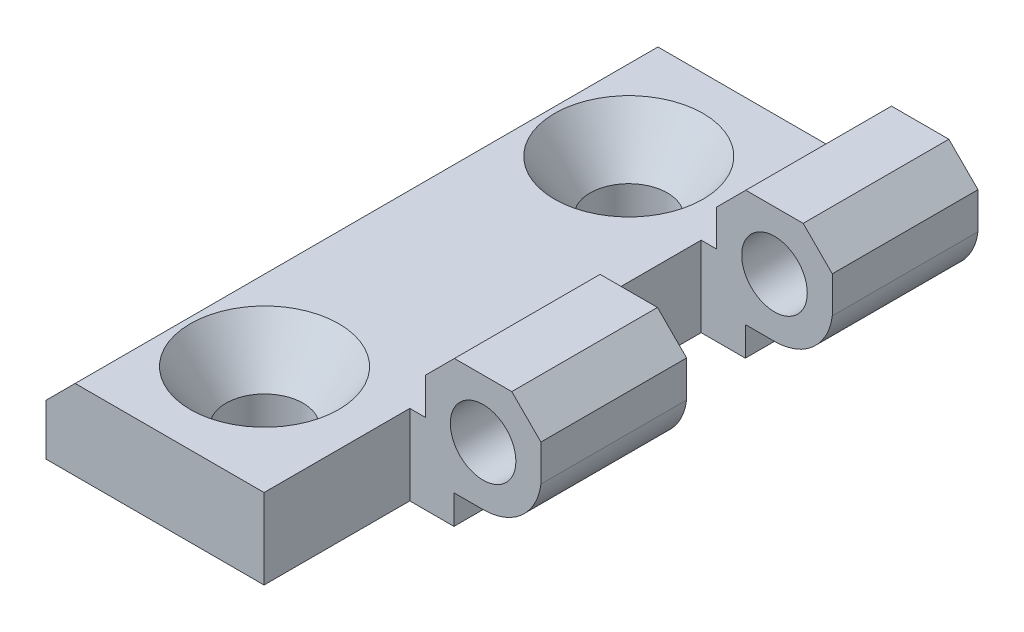
ISO-10303-21;
HEADER;
FILE_DESCRIPTION(('STEP AP214'),'2;1');
FILE_NAME('part.step','',(''),(''),'','','');
FILE_SCHEMA(('AUTOMOTIVE_DESIGN { 1 0 10303 214 1 1 1 1 }'));
ENDSEC;
DATA;
#1=APPLICATION_CONTEXT('core data for automotive mechanical design processes');
#2=APPLICATION_PROTOCOL_DEFINITION('international standard','automotive_design',2000,#1);
#3=PRODUCT_CONTEXT('',#1,'mechanical');
#4=PRODUCT('Part','Part','',(#3));
#5=PRODUCT_RELATED_PRODUCT_CATEGORY('part','',(#4));
#6=PRODUCT_DEFINITION_FORMATION('','',#4);
#7=PRODUCT_DEFINITION_CONTEXT('part definition',#1,'design');
#8=PRODUCT_DEFINITION('design','',#6,#7);
#9=PRODUCT_DEFINITION_SHAPE('','',#8);
#10=(LENGTH_UNIT() NAMED_UNIT(*) SI_UNIT(.MILLI.,.METRE.));
#11=(NAMED_UNIT(*) PLANE_ANGLE_UNIT() SI_UNIT($,.RADIAN.));
#12=(NAMED_UNIT(*) SI_UNIT($,.STERADIAN.) SOLID_ANGLE_UNIT());
#13=UNCERTAINTY_MEASURE_WITH_UNIT(LENGTH_MEASURE(1.E-05),#10,'distance_accuracy_value','');
#14=(GEOMETRIC_REPRESENTATION_CONTEXT(3) GLOBAL_UNCERTAINTY_ASSIGNED_CONTEXT((#13)) GLOBAL_UNIT_ASSIGNED_CONTEXT((#10,
#11,#12)) REPRESENTATION_CONTEXT('',''));
#15=CARTESIAN_POINT('',(0.,0.,0.));
#16=DIRECTION('',(0.,0.,1.));
#17=DIRECTION('',(1.,0.,0.));
#18=AXIS2_PLACEMENT_3D('',#15,#16,#17);
#19=CARTESIAN_POINT('',(0.,5.5,0.));
#20=DIRECTION('',(0.,1.,0.));
#21=DIRECTION('',(0.,0.,1.));
#22=AXIS2_PLACEMENT_3D('',#19,#20,#21);
#23=PLANE('',#22);
#24=CARTESIAN_POINT('',(-12.5,5.5,-12.5));
#25=DIRECTION('',(0.,1.,0.));
#26=DIRECTION('',(0.,0.,1.));
#27=AXIS2_PLACEMENT_3D('',#24,#25,#26);
#28=CIRCLE('',#27,5.1);
#29=CARTESIAN_POINT('',(-12.5,5.5,-7.4));
#30=VERTEX_POINT('',#29);
#31=EDGE_CURVE('E813',#30,#30,#28,.T.);
#32=ORIENTED_EDGE('',*,*,#31,.F.);
#33=EDGE_LOOP('',(#32));
#34=FACE_BOUND('',#33,.T.);
#35=CARTESIAN_POINT('',(-12.5,5.5,12.5));
#36=DIRECTION('',(0.,1.,0.));
#37=DIRECTION('',(0.,0.,1.));
#38=AXIS2_PLACEMENT_3D('',#35,#36,#37);
#39=CIRCLE('',#38,5.1);
#40=CARTESIAN_POINT('',(-12.5,5.5,17.6));
#41=VERTEX_POINT('',#40);
#42=EDGE_CURVE('E260',#41,#41,#39,.T.);
#43=ORIENTED_EDGE('',*,*,#42,.F.);
#44=EDGE_LOOP('',(#43));
#45=FACE_BOUND('',#44,.T.);
#46=DIRECTION('',(1.,0.,0.));
#47=VECTOR('',#46,1.);
#48=CARTESIAN_POINT('',(-20.,5.5,20.));
#49=LINE('',#48,#47);
#50=CARTESIAN_POINT('',(-18.,5.5,20.));
#51=VERTEX_POINT('',#50);
#52=CARTESIAN_POINT('',(-5.03137303340311,5.5,20.));
#53=VERTEX_POINT('',#52);
#54=EDGE_CURVE('E232',#51,#53,#49,.T.);
#55=ORIENTED_EDGE('',*,*,#54,.T.);
#56=DIRECTION('',(0.,0.,-1.));
#57=VECTOR('',#56,1.);
#58=CARTESIAN_POINT('',(-5.03137303340312,5.5,0.));
#59=LINE('',#58,#57);
#60=CARTESIAN_POINT('',(-5.03137303340312,5.5,10.));
#61=VERTEX_POINT('',#60);
#62=EDGE_CURVE('E53',#53,#61,#59,.T.);
#63=ORIENTED_EDGE('',*,*,#62,.T.);
#64=DIRECTION('',(1.,0.,0.));
#65=VECTOR('',#64,1.);
#66=CARTESIAN_POINT('',(0.,5.5,10.));
#67=LINE('',#66,#65);
#68=CARTESIAN_POINT('',(-3.96862696659689,5.5,10.));
#69=VERTEX_POINT('',#68);
#70=EDGE_CURVE('E281',#61,#69,#67,.T.);
#71=ORIENTED_EDGE('',*,*,#70,.T.);
#72=DIRECTION('',(0.,0.,1.));
#73=VECTOR('',#72,1.);
#74=CARTESIAN_POINT('',(-3.96862696659689,5.5,-31.2694276695847));
#75=LINE('',#74,#73);
#76=CARTESIAN_POINT('',(-3.96862696659689,5.5,0.));
#77=VERTEX_POINT('',#76);
#78=EDGE_CURVE('E379',#77,#69,#75,.T.);
#79=ORIENTED_EDGE('',*,*,#78,.F.);
#80=DIRECTION('',(-1.,0.,0.));
#81=VECTOR('',#80,1.);
#82=CARTESIAN_POINT('',(0.,5.5,0.));
#83=LINE('',#82,#81);
#84=CARTESIAN_POINT('',(-5.03137303340312,5.5,0.));
#85=VERTEX_POINT('',#84);
#86=EDGE_CURVE('E340',#77,#85,#83,.T.);
#87=ORIENTED_EDGE('',*,*,#86,.T.);
#88=DIRECTION('',(0.,0.,-1.));
#89=VECTOR('',#88,1.);
#90=CARTESIAN_POINT('',(-5.03137303340312,5.5,0.));
#91=LINE('',#90,#89);
#92=CARTESIAN_POINT('',(-5.03137303340312,5.5,-10.));
#93=VERTEX_POINT('',#92);
#94=EDGE_CURVE('E358',#85,#93,#91,.T.);
#95=ORIENTED_EDGE('',*,*,#94,.T.);
#96=DIRECTION('',(1.,0.,0.));
#97=VECTOR('',#96,1.);
#98=CARTESIAN_POINT('',(0.,5.5,-10.));
#99=LINE('',#98,#97);
#100=CARTESIAN_POINT('',(-3.96862696659689,5.5,-10.));
#101=VERTEX_POINT('',#100);
#102=EDGE_CURVE('E321',#93,#101,#99,.T.);
#103=ORIENTED_EDGE('',*,*,#102,.T.);
#104=CARTESIAN_POINT('',(-3.96862696659689,5.5,-20.));
#105=VERTEX_POINT('',#104);
#106=EDGE_CURVE('E369',#105,#101,#75,.T.);
#107=ORIENTED_EDGE('',*,*,#106,.F.);
#108=DIRECTION('',(-1.,0.,0.));
#109=VECTOR('',#108,1.);
#110=CARTESIAN_POINT('',(-20.,5.5,-20.));
#111=LINE('',#110,#109);
#112=CARTESIAN_POINT('',(-18.,5.5,-20.));
#113=VERTEX_POINT('',#112);
#114=EDGE_CURVE('E241',#105,#113,#111,.T.);
#115=ORIENTED_EDGE('',*,*,#114,.T.);
#116=DIRECTION('',(0.,0.,1.));
#117=VECTOR('',#116,1.);
#118=CARTESIAN_POINT('',(-18.,5.5,20.));
#119=LINE('',#118,#117);
#120=EDGE_CURVE('E243',#113,#51,#119,.T.);
#121=ORIENTED_EDGE('',*,*,#120,.T.);
#122=EDGE_LOOP('',(#55,#63,#71,#79,#87,#95,#103,#107,#115,#121));
#123=FACE_BOUND('',#122,.T.);
#124=ADVANCED_FACE('F36',(#34,#45,#123),#23,.T.);
#125=CARTESIAN_POINT('',(0.,0.,0.));
#126=DIRECTION('',(0.,1.,0.));
#127=DIRECTION('',(0.,0.,1.));
#128=AXIS2_PLACEMENT_3D('',#125,#126,#127);
#129=PLANE('',#128);
#130=CARTESIAN_POINT('',(-12.5,0.,-12.5));
#131=DIRECTION('',(0.,1.,0.));
#132=DIRECTION('',(0.,0.,1.));
#133=AXIS2_PLACEMENT_3D('',#130,#131,#132);
#134=CIRCLE('',#133,2.65);
#135=CARTESIAN_POINT('',(-12.5,0.,-9.85));
#136=VERTEX_POINT('',#135);
#137=EDGE_CURVE('E40',#136,#136,#134,.T.);
#138=ORIENTED_EDGE('',*,*,#137,.T.);
#139=EDGE_LOOP('',(#138));
#140=FACE_BOUND('',#139,.T.);
#141=CARTESIAN_POINT('',(-12.5,0.,12.5));
#142=DIRECTION('',(0.,1.,0.));
#143=DIRECTION('',(0.,0.,1.));
#144=AXIS2_PLACEMENT_3D('',#141,#142,#143);
#145=CIRCLE('',#144,2.65);
#146=CARTESIAN_POINT('',(-12.5,0.,15.15));
#147=VERTEX_POINT('',#146);
#148=EDGE_CURVE('E222',#147,#147,#145,.T.);
#149=ORIENTED_EDGE('',*,*,#148,.T.);
#150=EDGE_LOOP('',(#149));
#151=FACE_BOUND('',#150,.T.);
#152=DIRECTION('',(0.,0.,1.));
#153=VECTOR('',#152,1.);
#154=CARTESIAN_POINT('',(-5.03137303340312,0.,10.));
#155=LINE('',#154,#153);
#156=CARTESIAN_POINT('',(-5.03137303340312,0.,10.));
#157=VERTEX_POINT('',#156);
#158=CARTESIAN_POINT('',(-5.03137303340311,0.,20.));
#159=VERTEX_POINT('',#158);
#160=EDGE_CURVE('E206',#157,#159,#155,.T.);
#161=ORIENTED_EDGE('',*,*,#160,.T.);
#162=DIRECTION('',(1.,0.,0.));
#163=VECTOR('',#162,1.);
#164=CARTESIAN_POINT('',(-20.,0.,20.));
#165=LINE('',#164,#163);
#166=CARTESIAN_POINT('',(-20.,0.,20.));
#167=VERTEX_POINT('',#166);
#168=EDGE_CURVE('E218',#167,#159,#165,.T.);
#169=ORIENTED_EDGE('',*,*,#168,.F.);
#170=DIRECTION('',(0.,0.,1.));
#171=VECTOR('',#170,1.);
#172=CARTESIAN_POINT('',(-20.,0.,-20.));
#173=LINE('',#172,#171);
#174=CARTESIAN_POINT('',(-20.,0.,-20.));
#175=VERTEX_POINT('',#174);
#176=EDGE_CURVE('E228',#175,#167,#173,.T.);
#177=ORIENTED_EDGE('',*,*,#176,.F.);
#178=DIRECTION('',(-1.,0.,0.));
#179=VECTOR('',#178,1.);
#180=CARTESIAN_POINT('',(-20.,0.,-20.));
#181=LINE('',#180,#179);
#182=CARTESIAN_POINT('',(-2.,0.,-20.));
#183=VERTEX_POINT('',#182);
#184=EDGE_CURVE('E227',#183,#175,#181,.T.);
#185=ORIENTED_EDGE('',*,*,#184,.F.);
#186=DIRECTION('',(0.,0.,1.));
#187=VECTOR('',#186,1.);
#188=CARTESIAN_POINT('',(-2.,0.,-20.));
#189=LINE('',#188,#187);
#190=CARTESIAN_POINT('',(-2.,0.,-10.));
#191=VERTEX_POINT('',#190);
#192=EDGE_CURVE('E235',#183,#191,#189,.T.);
#193=ORIENTED_EDGE('',*,*,#192,.T.);
#194=DIRECTION('',(-1.,0.,0.));
#195=VECTOR('',#194,1.);
#196=CARTESIAN_POINT('',(-5.03137303340312,0.,-10.));
#197=LINE('',#196,#195);
#198=CARTESIAN_POINT('',(-5.03137303340312,0.,-10.));
#199=VERTEX_POINT('',#198);
#200=EDGE_CURVE('E301',#191,#199,#197,.T.);
#201=ORIENTED_EDGE('',*,*,#200,.T.);
#202=DIRECTION('',(0.,0.,1.));
#203=VECTOR('',#202,1.);
#204=CARTESIAN_POINT('',(-5.03137303340312,0.,-10.));
#205=LINE('',#204,#203);
#206=CARTESIAN_POINT('',(-5.03137303340312,0.,0.));
#207=VERTEX_POINT('',#206);
#208=EDGE_CURVE('E297',#199,#207,#205,.T.);
#209=ORIENTED_EDGE('',*,*,#208,.T.);
#210=DIRECTION('',(1.,0.,0.));
#211=VECTOR('',#210,1.);
#212=CARTESIAN_POINT('',(-5.03137303340312,0.,0.));
#213=LINE('',#212,#211);
#214=CARTESIAN_POINT('',(-2.,0.,0.));
#215=VERTEX_POINT('',#214);
#216=EDGE_CURVE('E306',#207,#215,#213,.T.);
#217=ORIENTED_EDGE('',*,*,#216,.T.);
#218=CARTESIAN_POINT('',(-2.,0.,10.));
#219=VERTEX_POINT('',#218);
#220=EDGE_CURVE('E410',#215,#219,#189,.T.);
#221=ORIENTED_EDGE('',*,*,#220,.T.);
#222=DIRECTION('',(-1.,0.,0.));
#223=VECTOR('',#222,1.);
#224=CARTESIAN_POINT('',(-5.03137303340312,0.,10.));
#225=LINE('',#224,#223);
#226=EDGE_CURVE('E221',#219,#157,#225,.T.);
#227=ORIENTED_EDGE('',*,*,#226,.T.);
#228=EDGE_LOOP('',(#161,#169,#177,#185,#193,#201,#209,#217,#221,#227));
#229=FACE_BOUND('',#228,.T.);
#230=ADVANCED_FACE('F216',(#140,#151,#229),#129,.F.);
#231=CARTESIAN_POINT('',(-2.,0.,-20.));
#232=DIRECTION('',(-1.,0.,0.));
#233=DIRECTION('',(0.,0.,1.));
#234=AXIS2_PLACEMENT_3D('',#231,#232,#233);
#235=PLANE('',#234);
#236=DIRECTION('',(0.,1.,0.));
#237=VECTOR('',#236,1.);
#238=CARTESIAN_POINT('',(-2.,0.,10.));
#239=LINE('',#238,#237);
#240=CARTESIAN_POINT('',(-2.,2.,10.));
#241=VERTEX_POINT('',#240);
#242=EDGE_CURVE('E292',#219,#241,#239,.T.);
#243=ORIENTED_EDGE('',*,*,#242,.F.);
#244=ORIENTED_EDGE('',*,*,#220,.F.);
#245=DIRECTION('',(0.,-1.,0.));
#246=VECTOR('',#245,1.);
#247=CARTESIAN_POINT('',(-2.,0.,0.));
#248=LINE('',#247,#246);
#249=CARTESIAN_POINT('',(-2.,2.,0.));
#250=VERTEX_POINT('',#249);
#251=EDGE_CURVE('E352',#250,#215,#248,.T.);
#252=ORIENTED_EDGE('',*,*,#251,.F.);
#253=DIRECTION('',(0.,0.,1.));
#254=VECTOR('',#253,1.);
#255=CARTESIAN_POINT('',(-2.,2.,-20.));
#256=LINE('',#255,#254);
#257=EDGE_CURVE('E414',#250,#241,#256,.T.);
#258=ORIENTED_EDGE('',*,*,#257,.T.);
#259=EDGE_LOOP('',(#243,#244,#252,#258));
#260=FACE_BOUND('',#259,.T.);
#261=ADVANCED_FACE('F483',(#260),#235,.F.);
#262=CARTESIAN_POINT('',(0.,2.,-20.));
#263=DIRECTION('',(0.,1.,0.));
#264=DIRECTION('',(-1.,0.,0.));
#265=AXIS2_PLACEMENT_3D('',#262,#263,#264);
#266=PLANE('',#265);
#267=DIRECTION('',(1.,0.,0.));
#268=VECTOR('',#267,1.);
#269=CARTESIAN_POINT('',(0.,2.,10.));
#270=LINE('',#269,#268);
#271=CARTESIAN_POINT('',(0.,2.,10.));
#272=VERTEX_POINT('',#271);
#273=EDGE_CURVE('E290',#241,#272,#270,.T.);
#274=ORIENTED_EDGE('',*,*,#273,.F.);
#275=ORIENTED_EDGE('',*,*,#257,.F.);
#276=DIRECTION('',(-1.,0.,0.));
#277=VECTOR('',#276,1.);
#278=CARTESIAN_POINT('',(0.,2.,0.));
#279=LINE('',#278,#277);
#280=CARTESIAN_POINT('',(0.,2.,0.));
#281=VERTEX_POINT('',#280);
#282=EDGE_CURVE('E350',#281,#250,#279,.T.);
#283=ORIENTED_EDGE('',*,*,#282,.F.);
#284=DIRECTION('',(0.,0.,1.));
#285=VECTOR('',#284,1.);
#286=CARTESIAN_POINT('',(0.,2.,-20.));
#287=LINE('',#286,#285);
#288=EDGE_CURVE('E407',#281,#272,#287,.T.);
#289=ORIENTED_EDGE('',*,*,#288,.T.);
#290=EDGE_LOOP('',(#274,#275,#283,#289));
#291=FACE_BOUND('',#290,.T.);
#292=ADVANCED_FACE('F492',(#291),#266,.F.);
#293=CARTESIAN_POINT('',(0.,6.,-31.2694276695847));
#294=DIRECTION('',(0.,0.,1.));
#295=DIRECTION('',(1.,0.,0.));
#296=AXIS2_PLACEMENT_3D('',#293,#294,#295);
#297=CYLINDRICAL_SURFACE('',#296,2.25);
#298=CARTESIAN_POINT('',(0.,6.,0.));
#299=DIRECTION('',(0.,0.,-1.));
#300=DIRECTION('',(-1.,0.,0.));
#301=AXIS2_PLACEMENT_3D('',#298,#299,#300);
#302=CIRCLE('',#301,2.25);
#303=CARTESIAN_POINT('',(-2.25,6.,0.));
#304=VERTEX_POINT('',#303);
#305=EDGE_CURVE('E354',#304,#304,#302,.F.);
#306=ORIENTED_EDGE('',*,*,#305,.F.);
#307=EDGE_LOOP('',(#306));
#308=FACE_BOUND('',#307,.T.);
#309=CARTESIAN_POINT('',(0.,6.,10.));
#310=DIRECTION('',(0.,0.,1.));
#311=DIRECTION('',(1.,0.,0.));
#312=AXIS2_PLACEMENT_3D('',#309,#310,#311);
#313=CIRCLE('',#312,2.25);
#314=CARTESIAN_POINT('',(2.25,6.,10.));
#315=VERTEX_POINT('',#314);
#316=EDGE_CURVE('E294',#315,#315,#313,.F.);
#317=ORIENTED_EDGE('',*,*,#316,.F.);
#318=EDGE_LOOP('',(#317));
#319=FACE_BOUND('',#318,.T.);
#320=ADVANCED_FACE('F669',(#308,#319),#297,.F.);
#321=CARTESIAN_POINT('',(0.,6.,-31.2694276695847));
#322=DIRECTION('',(0.,0.,1.));
#323=DIRECTION('',(1.,0.,0.));
#324=AXIS2_PLACEMENT_3D('',#321,#322,#323);
#325=CYLINDRICAL_SURFACE('',#324,4.);
#326=DIRECTION('',(0.,0.,1.));
#327=VECTOR('',#326,1.);
#328=CARTESIAN_POINT('',(3.96862696659689,5.5,-31.2694276695847));
#329=LINE('',#328,#327);
#330=CARTESIAN_POINT('',(3.96862696659688,5.5,0.));
#331=VERTEX_POINT('',#330);
#332=CARTESIAN_POINT('',(3.96862696659689,5.5,10.));
#333=VERTEX_POINT('',#332);
#334=EDGE_CURVE('E361',#331,#333,#329,.T.);
#335=ORIENTED_EDGE('',*,*,#334,.T.);
#336=CARTESIAN_POINT('',(0.,6.,10.));
#337=DIRECTION('',(0.,0.,1.));
#338=DIRECTION('',(1.,0.,0.));
#339=AXIS2_PLACEMENT_3D('',#336,#337,#338);
#340=CIRCLE('',#339,4.);
#341=EDGE_CURVE('E287',#333,#272,#340,.F.);
#342=ORIENTED_EDGE('',*,*,#341,.T.);
#343=ORIENTED_EDGE('',*,*,#288,.F.);
#344=CARTESIAN_POINT('',(0.,6.,0.));
#345=DIRECTION('',(0.,0.,-1.));
#346=DIRECTION('',(-1.,0.,0.));
#347=AXIS2_PLACEMENT_3D('',#344,#345,#346);
#348=CIRCLE('',#347,4.);
#349=EDGE_CURVE('E347',#281,#331,#348,.F.);
#350=ORIENTED_EDGE('',*,*,#349,.T.);
#351=EDGE_LOOP('',(#335,#342,#343,#350));
#352=FACE_BOUND('',#351,.T.);
#353=ADVANCED_FACE('F497',(#352),#325,.T.);
#354=CARTESIAN_POINT('',(3.96862696659689,5.5,-31.2694276695847));
#355=DIRECTION('',(1.,0.,0.));
#356=DIRECTION('',(0.,1.,0.));
#357=AXIS2_PLACEMENT_3D('',#354,#355,#356);
#358=PLANE('',#357);
#359=DIRECTION('',(0.,0.,1.));
#360=VECTOR('',#359,1.);
#361=CARTESIAN_POINT('',(3.96862696659689,8.,-31.2694276695847));
#362=LINE('',#361,#360);
#363=CARTESIAN_POINT('',(3.96862696659688,8.,0.));
#364=VERTEX_POINT('',#363);
#365=CARTESIAN_POINT('',(3.96862696659689,8.,10.));
#366=VERTEX_POINT('',#365);
#367=EDGE_CURVE('E395',#364,#366,#362,.T.);
#368=ORIENTED_EDGE('',*,*,#367,.T.);
#369=DIRECTION('',(0.,-1.,0.));
#370=VECTOR('',#369,1.);
#371=CARTESIAN_POINT('',(3.96862696659689,10.,10.));
#372=LINE('',#371,#370);
#373=EDGE_CURVE('E274',#366,#333,#372,.T.);
#374=ORIENTED_EDGE('',*,*,#373,.T.);
#375=ORIENTED_EDGE('',*,*,#334,.F.);
#376=DIRECTION('',(0.,-1.,0.));
#377=VECTOR('',#376,1.);
#378=CARTESIAN_POINT('',(3.96862696659688,10.,0.));
#379=LINE('',#378,#377);
#380=EDGE_CURVE('E315',#364,#331,#379,.T.);
#381=ORIENTED_EDGE('',*,*,#380,.F.);
#382=EDGE_LOOP('',(#368,#374,#375,#381));
#383=FACE_BOUND('',#382,.T.);
#384=ADVANCED_FACE('F501',(#383),#358,.T.);
#385=CARTESIAN_POINT('',(3.96862696659689,8.,-31.2694276695847));
#386=DIRECTION('',(0.707106781186548,0.707106781186547,0.));
#387=DIRECTION('',(-0.707106781186547,0.707106781186548,0.));
#388=AXIS2_PLACEMENT_3D('',#385,#386,#387);
#389=PLANE('',#388);
#390=DIRECTION('',(0.,0.,1.));
#391=VECTOR('',#390,1.);
#392=CARTESIAN_POINT('',(1.96862696659689,10.,-31.2694276695847));
#393=LINE('',#392,#391);
#394=CARTESIAN_POINT('',(1.96862696659689,10.,0.));
#395=VERTEX_POINT('',#394);
#396=CARTESIAN_POINT('',(1.96862696659689,10.,10.));
#397=VERTEX_POINT('',#396);
#398=EDGE_CURVE('E391',#395,#397,#393,.T.);
#399=ORIENTED_EDGE('',*,*,#398,.T.);
#400=DIRECTION('',(0.707106781186547,-0.707106781186548,0.));
#401=VECTOR('',#400,1.);
#402=CARTESIAN_POINT('',(3.96862696659689,8.,10.));
#403=LINE('',#402,#401);
#404=EDGE_CURVE('E284',#397,#366,#403,.T.);
#405=ORIENTED_EDGE('',*,*,#404,.T.);
#406=ORIENTED_EDGE('',*,*,#367,.F.);
#407=DIRECTION('',(-0.707106781186547,0.707106781186548,0.));
#408=VECTOR('',#407,1.);
#409=CARTESIAN_POINT('',(3.96862696659689,8.,0.));
#410=LINE('',#409,#408);
#411=EDGE_CURVE('E344',#364,#395,#410,.T.);
#412=ORIENTED_EDGE('',*,*,#411,.T.);
#413=EDGE_LOOP('',(#399,#405,#406,#412));
#414=FACE_BOUND('',#413,.T.);
#415=ADVANCED_FACE('F506',(#414),#389,.T.);
#416=CARTESIAN_POINT('',(-1.96862696659689,10.,-31.2694276695847));
#417=DIRECTION('',(0.,1.,0.));
#418=DIRECTION('',(0.,0.,1.));
#419=AXIS2_PLACEMENT_3D('',#416,#417,#418);
#420=PLANE('',#419);
#421=DIRECTION('',(0.,0.,1.));
#422=VECTOR('',#421,1.);
#423=CARTESIAN_POINT('',(-1.96862696659689,10.,-31.2694276695847));
#424=LINE('',#423,#422);
#425=CARTESIAN_POINT('',(-1.96862696659689,10.,0.));
#426=VERTEX_POINT('',#425);
#427=CARTESIAN_POINT('',(-1.96862696659689,10.,10.));
#428=VERTEX_POINT('',#427);
#429=EDGE_CURVE('E387',#426,#428,#424,.T.);
#430=ORIENTED_EDGE('',*,*,#429,.T.);
#431=DIRECTION('',(-1.,0.,0.));
#432=VECTOR('',#431,1.);
#433=CARTESIAN_POINT('',(-5.03137303340312,10.,10.));
#434=LINE('',#433,#432);
#435=EDGE_CURVE('E269',#397,#428,#434,.T.);
#436=ORIENTED_EDGE('',*,*,#435,.F.);
#437=ORIENTED_EDGE('',*,*,#398,.F.);
#438=DIRECTION('',(1.,0.,0.));
#439=VECTOR('',#438,1.);
#440=CARTESIAN_POINT('',(-5.03137303340312,10.,0.));
#441=LINE('',#440,#439);
#442=EDGE_CURVE('E298',#426,#395,#441,.T.);
#443=ORIENTED_EDGE('',*,*,#442,.F.);
#444=EDGE_LOOP('',(#430,#436,#437,#443));
#445=FACE_BOUND('',#444,.T.);
#446=ADVANCED_FACE('F511',(#445),#420,.T.);
#447=CARTESIAN_POINT('',(-3.96862696659689,8.,-31.2694276695847));
#448=DIRECTION('',(-0.707106781186549,0.707106781186546,0.));
#449=DIRECTION('',(-0.707106781186546,-0.707106781186549,0.));
#450=AXIS2_PLACEMENT_3D('',#447,#448,#449);
#451=PLANE('',#450);
#452=DIRECTION('',(0.,0.,1.));
#453=VECTOR('',#452,1.);
#454=CARTESIAN_POINT('',(-3.96862696659689,8.,-31.2694276695847));
#455=LINE('',#454,#453);
#456=CARTESIAN_POINT('',(-3.96862696659689,8.,0.));
#457=VERTEX_POINT('',#456);
#458=CARTESIAN_POINT('',(-3.96862696659689,8.,10.));
#459=VERTEX_POINT('',#458);
#460=EDGE_CURVE('E383',#457,#459,#455,.T.);
#461=ORIENTED_EDGE('',*,*,#460,.T.);
#462=DIRECTION('',(0.707106781186546,0.707106781186549,0.));
#463=VECTOR('',#462,1.);
#464=CARTESIAN_POINT('',(-3.96862696659689,8.,10.));
#465=LINE('',#464,#463);
#466=EDGE_CURVE('E278',#459,#428,#465,.T.);
#467=ORIENTED_EDGE('',*,*,#466,.T.);
#468=ORIENTED_EDGE('',*,*,#429,.F.);
#469=DIRECTION('',(-0.707106781186546,-0.707106781186549,0.));
#470=VECTOR('',#469,1.);
#471=CARTESIAN_POINT('',(-3.96862696659689,8.,0.));
#472=LINE('',#471,#470);
#473=EDGE_CURVE('E337',#426,#457,#472,.T.);
#474=ORIENTED_EDGE('',*,*,#473,.T.);
#475=EDGE_LOOP('',(#461,#467,#468,#474));
#476=FACE_BOUND('',#475,.T.);
#477=ADVANCED_FACE('F516',(#476),#451,.T.);
#478=CARTESIAN_POINT('',(-3.96862696659689,5.5,-31.2694276695847));
#479=DIRECTION('',(-1.,0.,0.));
#480=DIRECTION('',(0.,-1.,0.));
#481=AXIS2_PLACEMENT_3D('',#478,#479,#480);
#482=PLANE('',#481);
#483=ORIENTED_EDGE('',*,*,#78,.T.);
#484=DIRECTION('',(0.,1.,0.));
#485=VECTOR('',#484,1.);
#486=CARTESIAN_POINT('',(-3.96862696659689,5.5,10.));
#487=LINE('',#486,#485);
#488=EDGE_CURVE('E11',#69,#459,#487,.T.);
#489=ORIENTED_EDGE('',*,*,#488,.T.);
#490=ORIENTED_EDGE('',*,*,#460,.F.);
#491=DIRECTION('',(0.,-1.,0.));
#492=VECTOR('',#491,1.);
#493=CARTESIAN_POINT('',(-3.96862696659689,5.5,0.));
#494=LINE('',#493,#492);
#495=EDGE_CURVE('E212',#457,#77,#494,.T.);
#496=ORIENTED_EDGE('',*,*,#495,.T.);
#497=EDGE_LOOP('',(#483,#489,#490,#496));
#498=FACE_BOUND('',#497,.T.);
#499=ADVANCED_FACE('F520',(#498),#482,.T.);
#500=CARTESIAN_POINT('',(-20.,5.5,20.));
#501=DIRECTION('',(0.,0.,-1.));
#502=DIRECTION('',(-1.,0.,0.));
#503=AXIS2_PLACEMENT_3D('',#500,#501,#502);
#504=PLANE('',#503);
#505=DIRECTION('',(0.,-1.,0.));
#506=VECTOR('',#505,1.);
#507=CARTESIAN_POINT('',(-5.03137303340311,5.5,20.));
#508=LINE('',#507,#506);
#509=EDGE_CURVE('E45',#53,#159,#508,.T.);
#510=ORIENTED_EDGE('',*,*,#509,.F.);
#511=ORIENTED_EDGE('',*,*,#54,.F.);
#512=DIRECTION('',(-0.707106781186546,-0.707106781186549,0.));
#513=VECTOR('',#512,1.);
#514=CARTESIAN_POINT('',(-18.,5.5,20.));
#515=LINE('',#514,#513);
#516=CARTESIAN_POINT('',(-20.,3.49999999999999,20.));
#517=VERTEX_POINT('',#516);
#518=EDGE_CURVE('E246',#51,#517,#515,.T.);
#519=ORIENTED_EDGE('',*,*,#518,.T.);
#520=DIRECTION('',(0.,-1.,0.));
#521=VECTOR('',#520,1.);
#522=CARTESIAN_POINT('',(-20.,5.5,20.));
#523=LINE('',#522,#521);
#524=EDGE_CURVE('E226',#517,#167,#523,.T.);
#525=ORIENTED_EDGE('',*,*,#524,.T.);
#526=ORIENTED_EDGE('',*,*,#168,.T.);
#527=EDGE_LOOP('',(#510,#511,#519,#525,#526));
#528=FACE_BOUND('',#527,.T.);
#529=ADVANCED_FACE('F224',(#528),#504,.F.);
#530=DIRECTION('',(0.,1.,0.));
#531=VECTOR('',#530,1.);
#532=CARTESIAN_POINT('',(-2.,0.,-10.));
#533=LINE('',#532,#531);
#534=CARTESIAN_POINT('',(-2.,2.,-10.));
#535=VERTEX_POINT('',#534);
#536=EDGE_CURVE('E332',#191,#535,#533,.T.);
#537=ORIENTED_EDGE('',*,*,#536,.F.);
#538=ORIENTED_EDGE('',*,*,#192,.F.);
#539=DIRECTION('',(0.,-1.,0.));
#540=VECTOR('',#539,1.);
#541=CARTESIAN_POINT('',(-2.,0.,-20.));
#542=LINE('',#541,#540);
#543=CARTESIAN_POINT('',(-2.,2.,-20.));
#544=VERTEX_POINT('',#543);
#545=EDGE_CURVE('E404',#544,#183,#542,.T.);
#546=ORIENTED_EDGE('',*,*,#545,.F.);
#547=EDGE_CURVE('E411',#544,#535,#256,.T.);
#548=ORIENTED_EDGE('',*,*,#547,.T.);
#549=EDGE_LOOP('',(#537,#538,#546,#548));
#550=FACE_BOUND('',#549,.T.);
#551=ADVANCED_FACE('F440',(#550),#235,.F.);
#552=DIRECTION('',(1.,0.,0.));
#553=VECTOR('',#552,1.);
#554=CARTESIAN_POINT('',(0.,2.,-10.));
#555=LINE('',#554,#553);
#556=CARTESIAN_POINT('',(0.,2.,-10.));
#557=VERTEX_POINT('',#556);
#558=EDGE_CURVE('E330',#535,#557,#555,.T.);
#559=ORIENTED_EDGE('',*,*,#558,.F.);
#560=ORIENTED_EDGE('',*,*,#547,.F.);
#561=DIRECTION('',(-1.,0.,0.));
#562=VECTOR('',#561,1.);
#563=CARTESIAN_POINT('',(0.,2.,-20.));
#564=LINE('',#563,#562);
#565=CARTESIAN_POINT('',(0.,2.,-20.));
#566=VERTEX_POINT('',#565);
#567=EDGE_CURVE('E401',#566,#544,#564,.T.);
#568=ORIENTED_EDGE('',*,*,#567,.F.);
#569=EDGE_CURVE('E415',#566,#557,#287,.T.);
#570=ORIENTED_EDGE('',*,*,#569,.T.);
#571=EDGE_LOOP('',(#559,#560,#568,#570));
#572=FACE_BOUND('',#571,.T.);
#573=ADVANCED_FACE('F445',(#572),#266,.F.);
#574=CARTESIAN_POINT('',(0.,6.,-20.));
#575=DIRECTION('',(0.,0.,1.));
#576=DIRECTION('',(1.,0.,0.));
#577=AXIS2_PLACEMENT_3D('',#574,#575,#576);
#578=CIRCLE('',#577,2.25);
#579=CARTESIAN_POINT('',(2.25,6.,-20.));
#580=VERTEX_POINT('',#579);
#581=EDGE_CURVE('E364',#580,#580,#578,.F.);
#582=ORIENTED_EDGE('',*,*,#581,.T.);
#583=EDGE_LOOP('',(#582));
#584=FACE_BOUND('',#583,.T.);
#585=CARTESIAN_POINT('',(0.,6.,-10.));
#586=DIRECTION('',(0.,0.,1.));
#587=DIRECTION('',(1.,0.,0.));
#588=AXIS2_PLACEMENT_3D('',#585,#586,#587);
#589=CIRCLE('',#588,2.25);
#590=CARTESIAN_POINT('',(2.25,6.,-10.));
#591=VERTEX_POINT('',#590);
#592=EDGE_CURVE('E334',#591,#591,#589,.F.);
#593=ORIENTED_EDGE('',*,*,#592,.F.);
#594=EDGE_LOOP('',(#593));
#595=FACE_BOUND('',#594,.T.);
#596=ADVANCED_FACE('F677',(#584,#595),#297,.F.);
#597=CARTESIAN_POINT('',(3.96862696659689,5.5,-20.));
#598=VERTEX_POINT('',#597);
#599=CARTESIAN_POINT('',(3.96862696659688,5.5,-10.));
#600=VERTEX_POINT('',#599);
#601=EDGE_CURVE('E396',#598,#600,#329,.T.);
#602=ORIENTED_EDGE('',*,*,#601,.T.);
#603=CARTESIAN_POINT('',(0.,6.,-10.));
#604=DIRECTION('',(0.,0.,1.));
#605=DIRECTION('',(1.,0.,0.));
#606=AXIS2_PLACEMENT_3D('',#603,#604,#605);
#607=CIRCLE('',#606,4.);
#608=EDGE_CURVE('E327',#600,#557,#607,.F.);
#609=ORIENTED_EDGE('',*,*,#608,.T.);
#610=ORIENTED_EDGE('',*,*,#569,.F.);
#611=CARTESIAN_POINT('',(0.,6.,-20.));
#612=DIRECTION('',(0.,0.,1.));
#613=DIRECTION('',(1.,0.,0.));
#614=AXIS2_PLACEMENT_3D('',#611,#612,#613);
#615=CIRCLE('',#614,4.);
#616=EDGE_CURVE('E365',#598,#566,#615,.F.);
#617=ORIENTED_EDGE('',*,*,#616,.F.);
#618=EDGE_LOOP('',(#602,#609,#610,#617));
#619=FACE_BOUND('',#618,.T.);
#620=ADVANCED_FACE('F448',(#619),#325,.T.);
#621=CARTESIAN_POINT('',(3.96862696659689,8.,-20.));
#622=VERTEX_POINT('',#621);
#623=CARTESIAN_POINT('',(3.96862696659688,8.00000000000001,-10.));
#624=VERTEX_POINT('',#623);
#625=EDGE_CURVE('E392',#622,#624,#362,.T.);
#626=ORIENTED_EDGE('',*,*,#625,.T.);
#627=DIRECTION('',(0.,-1.,0.));
#628=VECTOR('',#627,1.);
#629=CARTESIAN_POINT('',(3.96862696659688,10.,-10.));
#630=LINE('',#629,#628);
#631=EDGE_CURVE('E312',#624,#600,#630,.T.);
#632=ORIENTED_EDGE('',*,*,#631,.T.);
#633=ORIENTED_EDGE('',*,*,#601,.F.);
#634=DIRECTION('',(0.,-1.,0.));
#635=VECTOR('',#634,1.);
#636=CARTESIAN_POINT('',(3.96862696659689,5.5,-20.));
#637=LINE('',#636,#635);
#638=EDGE_CURVE('E362',#622,#598,#637,.T.);
#639=ORIENTED_EDGE('',*,*,#638,.F.);
#640=EDGE_LOOP('',(#626,#632,#633,#639));
#641=FACE_BOUND('',#640,.T.);
#642=ADVANCED_FACE('F454',(#641),#358,.T.);
#643=CARTESIAN_POINT('',(1.96862696659689,10.,-20.));
#644=VERTEX_POINT('',#643);
#645=CARTESIAN_POINT('',(1.96862696659689,10.,-10.));
#646=VERTEX_POINT('',#645);
#647=EDGE_CURVE('E388',#644,#646,#393,.T.);
#648=ORIENTED_EDGE('',*,*,#647,.T.);
#649=DIRECTION('',(0.707106781186547,-0.707106781186548,0.));
#650=VECTOR('',#649,1.);
#651=CARTESIAN_POINT('',(3.96862696659689,8.,-10.));
#652=LINE('',#651,#650);
#653=EDGE_CURVE('E324',#646,#624,#652,.T.);
#654=ORIENTED_EDGE('',*,*,#653,.T.);
#655=ORIENTED_EDGE('',*,*,#625,.F.);
#656=DIRECTION('',(0.707106781186547,-0.707106781186548,0.));
#657=VECTOR('',#656,1.);
#658=CARTESIAN_POINT('',(3.96862696659689,8.,-20.));
#659=LINE('',#658,#657);
#660=EDGE_CURVE('E366',#644,#622,#659,.T.);
#661=ORIENTED_EDGE('',*,*,#660,.F.);
#662=EDGE_LOOP('',(#648,#654,#655,#661));
#663=FACE_BOUND('',#662,.T.);
#664=ADVANCED_FACE('F457',(#663),#389,.T.);
#665=CARTESIAN_POINT('',(-1.96862696659689,10.,-20.));
#666=VERTEX_POINT('',#665);
#667=CARTESIAN_POINT('',(-1.96862696659689,10.,-10.));
#668=VERTEX_POINT('',#667);
#669=EDGE_CURVE('E384',#666,#668,#424,.T.);
#670=ORIENTED_EDGE('',*,*,#669,.T.);
#671=DIRECTION('',(-1.,0.,0.));
#672=VECTOR('',#671,1.);
#673=CARTESIAN_POINT('',(-5.03137303340312,10.,-10.));
#674=LINE('',#673,#672);
#675=EDGE_CURVE('E300',#646,#668,#674,.T.);
#676=ORIENTED_EDGE('',*,*,#675,.F.);
#677=ORIENTED_EDGE('',*,*,#647,.F.);
#678=DIRECTION('',(1.,0.,0.));
#679=VECTOR('',#678,1.);
#680=CARTESIAN_POINT('',(-1.96862696659689,10.,-20.));
#681=LINE('',#680,#679);
#682=EDGE_CURVE('E368',#666,#644,#681,.T.);
#683=ORIENTED_EDGE('',*,*,#682,.F.);
#684=EDGE_LOOP('',(#670,#676,#677,#683));
#685=FACE_BOUND('',#684,.T.);
#686=ADVANCED_FACE('F461',(#685),#420,.T.);
#687=CARTESIAN_POINT('',(-3.96862696659689,8.,-20.));
#688=VERTEX_POINT('',#687);
#689=CARTESIAN_POINT('',(-3.96862696659689,8.,-10.));
#690=VERTEX_POINT('',#689);
#691=EDGE_CURVE('E380',#688,#690,#455,.T.);
#692=ORIENTED_EDGE('',*,*,#691,.T.);
#693=DIRECTION('',(0.707106781186546,0.707106781186549,0.));
#694=VECTOR('',#693,1.);
#695=CARTESIAN_POINT('',(-3.96862696659689,8.,-10.));
#696=LINE('',#695,#694);
#697=EDGE_CURVE('E61',#690,#668,#696,.T.);
#698=ORIENTED_EDGE('',*,*,#697,.T.);
#699=ORIENTED_EDGE('',*,*,#669,.F.);
#700=DIRECTION('',(0.707106781186546,0.707106781186549,0.));
#701=VECTOR('',#700,1.);
#702=CARTESIAN_POINT('',(-3.96862696659689,8.,-20.));
#703=LINE('',#702,#701);
#704=EDGE_CURVE('E371',#688,#666,#703,.T.);
#705=ORIENTED_EDGE('',*,*,#704,.F.);
#706=EDGE_LOOP('',(#692,#698,#699,#705));
#707=FACE_BOUND('',#706,.T.);
#708=ADVANCED_FACE('F464',(#707),#451,.T.);
#709=ORIENTED_EDGE('',*,*,#106,.T.);
#710=DIRECTION('',(0.,1.,0.));
#711=VECTOR('',#710,1.);
#712=CARTESIAN_POINT('',(-3.96862696659689,5.5,-10.));
#713=LINE('',#712,#711);
#714=EDGE_CURVE('E252',#101,#690,#713,.T.);
#715=ORIENTED_EDGE('',*,*,#714,.T.);
#716=ORIENTED_EDGE('',*,*,#691,.F.);
#717=DIRECTION('',(0.,1.,0.));
#718=VECTOR('',#717,1.);
#719=CARTESIAN_POINT('',(-3.96862696659689,5.5,-20.));
#720=LINE('',#719,#718);
#721=EDGE_CURVE('E373',#105,#688,#720,.T.);
#722=ORIENTED_EDGE('',*,*,#721,.F.);
#723=EDGE_LOOP('',(#709,#715,#716,#722));
#724=FACE_BOUND('',#723,.T.);
#725=ADVANCED_FACE('F468',(#724),#482,.T.);
#726=CARTESIAN_POINT('',(-20.,5.5,-20.));
#727=DIRECTION('',(1.,0.,0.));
#728=DIRECTION('',(0.,0.,-1.));
#729=AXIS2_PLACEMENT_3D('',#726,#727,#728);
#730=PLANE('',#729);
#731=ORIENTED_EDGE('',*,*,#524,.F.);
#732=DIRECTION('',(0.,0.,-1.));
#733=VECTOR('',#732,1.);
#734=CARTESIAN_POINT('',(-20.,3.49999999999999,-20.));
#735=LINE('',#734,#733);
#736=CARTESIAN_POINT('',(-20.,3.49999999999999,-20.));
#737=VERTEX_POINT('',#736);
#738=EDGE_CURVE('E248',#517,#737,#735,.T.);
#739=ORIENTED_EDGE('',*,*,#738,.T.);
#740=DIRECTION('',(0.,-1.,0.));
#741=VECTOR('',#740,1.);
#742=CARTESIAN_POINT('',(-20.,5.5,-20.));
#743=LINE('',#742,#741);
#744=EDGE_CURVE('E239',#737,#175,#743,.T.);
#745=ORIENTED_EDGE('',*,*,#744,.T.);
#746=ORIENTED_EDGE('',*,*,#176,.T.);
#747=EDGE_LOOP('',(#731,#739,#745,#746));
#748=FACE_BOUND('',#747,.T.);
#749=ADVANCED_FACE('F432',(#748),#730,.F.);
#750=CARTESIAN_POINT('',(-20.,5.5,-20.));
#751=DIRECTION('',(0.,0.,1.));
#752=DIRECTION('',(1.,0.,0.));
#753=AXIS2_PLACEMENT_3D('',#750,#751,#752);
#754=PLANE('',#753);
#755=ORIENTED_EDGE('',*,*,#581,.F.);
#756=EDGE_LOOP('',(#755));
#757=FACE_BOUND('',#756,.T.);
#758=ORIENTED_EDGE('',*,*,#744,.F.);
#759=DIRECTION('',(0.707106781186546,0.707106781186549,0.));
#760=VECTOR('',#759,1.);
#761=CARTESIAN_POINT('',(-18.,5.5,-20.));
#762=LINE('',#761,#760);
#763=EDGE_CURVE('E250',#737,#113,#762,.T.);
#764=ORIENTED_EDGE('',*,*,#763,.T.);
#765=ORIENTED_EDGE('',*,*,#114,.F.);
#766=ORIENTED_EDGE('',*,*,#721,.T.);
#767=ORIENTED_EDGE('',*,*,#704,.T.);
#768=ORIENTED_EDGE('',*,*,#682,.T.);
#769=ORIENTED_EDGE('',*,*,#660,.T.);
#770=ORIENTED_EDGE('',*,*,#638,.T.);
#771=ORIENTED_EDGE('',*,*,#616,.T.);
#772=ORIENTED_EDGE('',*,*,#567,.T.);
#773=ORIENTED_EDGE('',*,*,#545,.T.);
#774=ORIENTED_EDGE('',*,*,#184,.T.);
#775=EDGE_LOOP('',(#758,#764,#765,#766,#767,#768,#769,#770,#771,#772,#773,#774));
#776=FACE_BOUND('',#775,.T.);
#777=ADVANCED_FACE('F435',(#757,#776),#754,.F.);
#778=CARTESIAN_POINT('',(-18.,5.5,0.));
#779=DIRECTION('',(-0.707106781186549,0.707106781186546,0.));
#780=DIRECTION('',(0.,0.,-1.));
#781=AXIS2_PLACEMENT_3D('',#778,#779,#780);
#782=PLANE('',#781);
#783=ORIENTED_EDGE('',*,*,#763,.F.);
#784=ORIENTED_EDGE('',*,*,#738,.F.);
#785=ORIENTED_EDGE('',*,*,#518,.F.);
#786=ORIENTED_EDGE('',*,*,#120,.F.);
#787=EDGE_LOOP('',(#783,#784,#785,#786));
#788=FACE_BOUND('',#787,.T.);
#789=ADVANCED_FACE('F38',(#788),#782,.T.);
#790=CARTESIAN_POINT('',(-5.03137303340312,10.,0.));
#791=DIRECTION('',(0.,0.,-1.));
#792=DIRECTION('',(-1.,0.,0.));
#793=AXIS2_PLACEMENT_3D('',#790,#791,#792);
#794=PLANE('',#793);
#795=ORIENTED_EDGE('',*,*,#251,.T.);
#796=ORIENTED_EDGE('',*,*,#216,.F.);
#797=DIRECTION('',(0.,-1.,0.));
#798=VECTOR('',#797,1.);
#799=CARTESIAN_POINT('',(-5.03137303340312,10.,0.));
#800=LINE('',#799,#798);
#801=EDGE_CURVE('E317',#85,#207,#800,.T.);
#802=ORIENTED_EDGE('',*,*,#801,.F.);
#803=ORIENTED_EDGE('',*,*,#86,.F.);
#804=ORIENTED_EDGE('',*,*,#495,.F.);
#805=ORIENTED_EDGE('',*,*,#473,.F.);
#806=ORIENTED_EDGE('',*,*,#442,.T.);
#807=ORIENTED_EDGE('',*,*,#411,.F.);
#808=ORIENTED_EDGE('',*,*,#380,.T.);
#809=ORIENTED_EDGE('',*,*,#349,.F.);
#810=ORIENTED_EDGE('',*,*,#282,.T.);
#811=EDGE_LOOP('',(#795,#796,#802,#803,#804,#805,#806,#807,#808,#809,#810));
#812=FACE_BOUND('',#811,.T.);
#813=ORIENTED_EDGE('',*,*,#305,.T.);
#814=EDGE_LOOP('',(#813));
#815=FACE_BOUND('',#814,.T.);
#816=ADVANCED_FACE('F477',(#812,#815),#794,.T.);
#817=CARTESIAN_POINT('',(-5.03137303340312,10.,-10.));
#818=DIRECTION('',(0.,0.,1.));
#819=DIRECTION('',(1.,0.,0.));
#820=AXIS2_PLACEMENT_3D('',#817,#818,#819);
#821=PLANE('',#820);
#822=ORIENTED_EDGE('',*,*,#536,.T.);
#823=ORIENTED_EDGE('',*,*,#558,.T.);
#824=ORIENTED_EDGE('',*,*,#608,.F.);
#825=ORIENTED_EDGE('',*,*,#631,.F.);
#826=ORIENTED_EDGE('',*,*,#653,.F.);
#827=ORIENTED_EDGE('',*,*,#675,.T.);
#828=ORIENTED_EDGE('',*,*,#697,.F.);
#829=ORIENTED_EDGE('',*,*,#714,.F.);
#830=ORIENTED_EDGE('',*,*,#102,.F.);
#831=DIRECTION('',(0.,-1.,0.));
#832=VECTOR('',#831,1.);
#833=CARTESIAN_POINT('',(-5.03137303340312,10.,-10.));
#834=LINE('',#833,#832);
#835=EDGE_CURVE('E303',#93,#199,#834,.T.);
#836=ORIENTED_EDGE('',*,*,#835,.T.);
#837=ORIENTED_EDGE('',*,*,#200,.F.);
#838=EDGE_LOOP('',(#822,#823,#824,#825,#826,#827,#828,#829,#830,#836,#837));
#839=FACE_BOUND('',#838,.T.);
#840=ORIENTED_EDGE('',*,*,#592,.T.);
#841=EDGE_LOOP('',(#840));
#842=FACE_BOUND('',#841,.T.);
#843=ADVANCED_FACE('F442',(#839,#842),#821,.T.);
#844=CARTESIAN_POINT('',(-5.03137303340312,10.,-10.));
#845=DIRECTION('',(1.,0.,0.));
#846=DIRECTION('',(0.,0.,-1.));
#847=AXIS2_PLACEMENT_3D('',#844,#845,#846);
#848=PLANE('',#847);
#849=ORIENTED_EDGE('',*,*,#801,.T.);
#850=ORIENTED_EDGE('',*,*,#208,.F.);
#851=ORIENTED_EDGE('',*,*,#835,.F.);
#852=ORIENTED_EDGE('',*,*,#94,.F.);
#853=EDGE_LOOP('',(#849,#850,#851,#852));
#854=FACE_BOUND('',#853,.T.);
#855=ADVANCED_FACE('F473',(#854),#848,.T.);
#856=CARTESIAN_POINT('',(-5.03137303340312,10.,10.));
#857=DIRECTION('',(0.,0.,1.));
#858=DIRECTION('',(1.,0.,0.));
#859=AXIS2_PLACEMENT_3D('',#856,#857,#858);
#860=PLANE('',#859);
#861=ORIENTED_EDGE('',*,*,#242,.T.);
#862=ORIENTED_EDGE('',*,*,#273,.T.);
#863=ORIENTED_EDGE('',*,*,#341,.F.);
#864=ORIENTED_EDGE('',*,*,#373,.F.);
#865=ORIENTED_EDGE('',*,*,#404,.F.);
#866=ORIENTED_EDGE('',*,*,#435,.T.);
#867=ORIENTED_EDGE('',*,*,#466,.F.);
#868=ORIENTED_EDGE('',*,*,#488,.F.);
#869=ORIENTED_EDGE('',*,*,#70,.F.);
#870=DIRECTION('',(0.,-1.,0.));
#871=VECTOR('',#870,1.);
#872=CARTESIAN_POINT('',(-5.03137303340312,10.,10.));
#873=LINE('',#872,#871);
#874=EDGE_CURVE('E270',#61,#157,#873,.T.);
#875=ORIENTED_EDGE('',*,*,#874,.T.);
#876=ORIENTED_EDGE('',*,*,#226,.F.);
#877=EDGE_LOOP('',(#861,#862,#863,#864,#865,#866,#867,#868,#869,#875,#876));
#878=FACE_BOUND('',#877,.T.);
#879=ORIENTED_EDGE('',*,*,#316,.T.);
#880=EDGE_LOOP('',(#879));
#881=FACE_BOUND('',#880,.T.);
#882=ADVANCED_FACE('F488',(#878,#881),#860,.T.);
#883=CARTESIAN_POINT('',(-5.03137303340312,10.,10.));
#884=DIRECTION('',(1.,0.,0.));
#885=DIRECTION('',(0.,0.,-1.));
#886=AXIS2_PLACEMENT_3D('',#883,#884,#885);
#887=PLANE('',#886);
#888=ORIENTED_EDGE('',*,*,#509,.T.);
#889=ORIENTED_EDGE('',*,*,#160,.F.);
#890=ORIENTED_EDGE('',*,*,#874,.F.);
#891=ORIENTED_EDGE('',*,*,#62,.F.);
#892=EDGE_LOOP('',(#888,#889,#890,#891));
#893=FACE_BOUND('',#892,.T.);
#894=ADVANCED_FACE('F205',(#893),#887,.T.);
#895=CARTESIAN_POINT('',(-12.5,5.5,12.5));
#896=DIRECTION('',(0.,1.,0.));
#897=DIRECTION('',(0.,0.,1.));
#898=AXIS2_PLACEMENT_3D('',#895,#896,#897);
#899=CYLINDRICAL_SURFACE('',#898,2.65);
#900=CARTESIAN_POINT('',(-12.5,2.00103738348182,12.5));
#901=DIRECTION('',(0.,1.,0.));
#902=DIRECTION('',(0.,0.,1.));
#903=AXIS2_PLACEMENT_3D('',#900,#901,#902);
#904=CIRCLE('',#903,2.65);
#905=CARTESIAN_POINT('',(-12.5,2.00103738348182,15.15));
#906=VERTEX_POINT('',#905);
#907=EDGE_CURVE('E256',#906,#906,#904,.T.);
#908=ORIENTED_EDGE('',*,*,#907,.T.);
#909=EDGE_LOOP('',(#908));
#910=FACE_BOUND('',#909,.T.);
#911=ORIENTED_EDGE('',*,*,#148,.F.);
#912=EDGE_LOOP('',(#911));
#913=FACE_BOUND('',#912,.T.);
#914=ADVANCED_FACE('F592',(#910,#913),#899,.F.);
#915=CARTESIAN_POINT('',(-12.5,5.5,12.5));
#916=DIRECTION('',(0.,1.,0.));
#917=DIRECTION('',(0.,0.,1.));
#918=AXIS2_PLACEMENT_3D('',#915,#916,#917);
#919=CONICAL_SURFACE('',#918,5.1,0.610865238198016);
#920=ORIENTED_EDGE('',*,*,#907,.F.);
#921=EDGE_LOOP('',(#920));
#922=FACE_BOUND('',#921,.T.);
#923=ORIENTED_EDGE('',*,*,#42,.T.);
#924=EDGE_LOOP('',(#923));
#925=FACE_BOUND('',#924,.T.);
#926=ADVANCED_FACE('F600',(#922,#925),#919,.F.);
#927=CARTESIAN_POINT('',(-12.5,5.5,-12.5));
#928=DIRECTION('',(0.,1.,0.));
#929=DIRECTION('',(0.,0.,1.));
#930=AXIS2_PLACEMENT_3D('',#927,#928,#929);
#931=CYLINDRICAL_SURFACE('',#930,2.65);
#932=CARTESIAN_POINT('',(-12.5,2.00103738348182,-12.5));
#933=DIRECTION('',(0.,1.,0.));
#934=DIRECTION('',(0.,0.,1.));
#935=AXIS2_PLACEMENT_3D('',#932,#933,#934);
#936=CIRCLE('',#935,2.65);
#937=CARTESIAN_POINT('',(-12.5,2.00103738348182,-9.85));
#938=VERTEX_POINT('',#937);
#939=EDGE_CURVE('E817',#938,#938,#936,.T.);
#940=ORIENTED_EDGE('',*,*,#939,.T.);
#941=EDGE_LOOP('',(#940));
#942=FACE_BOUND('',#941,.T.);
#943=ORIENTED_EDGE('',*,*,#137,.F.);
#944=EDGE_LOOP('',(#943));
#945=FACE_BOUND('',#944,.T.);
#946=ADVANCED_FACE('F608',(#942,#945),#931,.F.);
#947=CARTESIAN_POINT('',(-12.5,5.5,-12.5));
#948=DIRECTION('',(0.,1.,0.));
#949=DIRECTION('',(0.,0.,1.));
#950=AXIS2_PLACEMENT_3D('',#947,#948,#949);
#951=CONICAL_SURFACE('',#950,5.1,0.610865238198016);
#952=ORIENTED_EDGE('',*,*,#939,.F.);
#953=EDGE_LOOP('',(#952));
#954=FACE_BOUND('',#953,.T.);
#955=ORIENTED_EDGE('',*,*,#31,.T.);
#956=EDGE_LOOP('',(#955));
#957=FACE_BOUND('',#956,.T.);
#958=ADVANCED_FACE('F616',(#954,#957),#951,.F.);
#959=CLOSED_SHELL('',(#124,#230,#261,#292,#320,#353,#384,#415,#446,#477,#499,#529,#551,#573,
#596,#620,#642,#664,#686,#708,#725,#749,#777,#789,#816,#843,#855,#882,#894,#914,#926,#946,#958));
#960=MANIFOLD_SOLID_BREP('B2',#959);
#961=ADVANCED_BREP_SHAPE_REPRESENTATION('',(#18,#960),#14);
#962=SHAPE_DEFINITION_REPRESENTATION(#9,#961);
ENDSEC;
END-ISO-10303-21;
